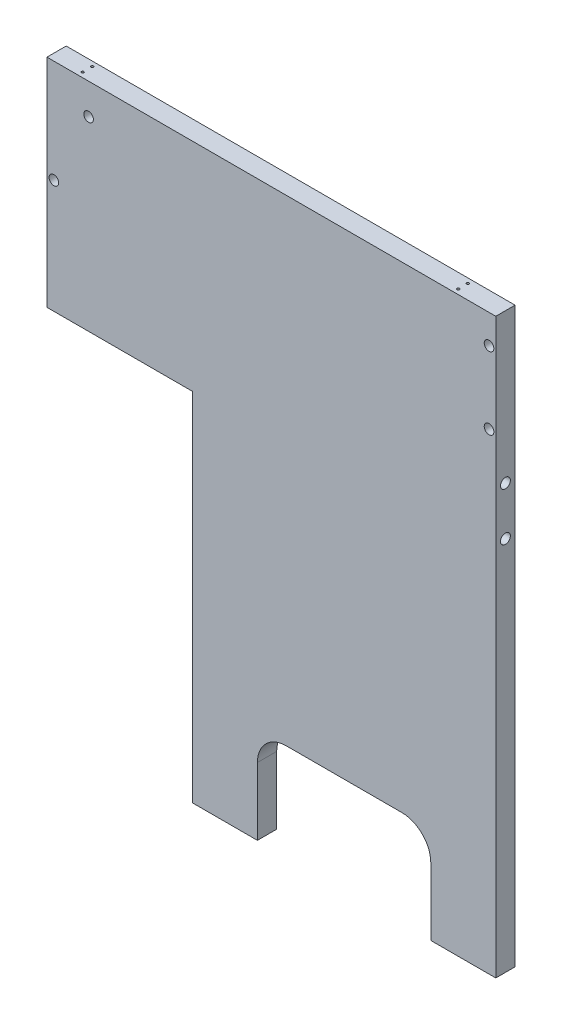
ISO-10303-21;
HEADER;
FILE_DESCRIPTION(('STEP AP214'),'2;1');
FILE_NAME('part.step','',(''),(''),'','','');
FILE_SCHEMA(('AUTOMOTIVE_DESIGN { 1 0 10303 214 1 1 1 1 }'));
ENDSEC;
DATA;
#1=APPLICATION_CONTEXT('core data for automotive mechanical design processes');
#2=APPLICATION_PROTOCOL_DEFINITION('international standard','automotive_design',2000,#1);
#3=PRODUCT_CONTEXT('',#1,'mechanical');
#4=PRODUCT('Part','Part','',(#3));
#5=PRODUCT_RELATED_PRODUCT_CATEGORY('part','',(#4));
#6=PRODUCT_DEFINITION_FORMATION('','',#4);
#7=PRODUCT_DEFINITION_CONTEXT('part definition',#1,'design');
#8=PRODUCT_DEFINITION('design','',#6,#7);
#9=PRODUCT_DEFINITION_SHAPE('','',#8);
#10=(LENGTH_UNIT() NAMED_UNIT(*) SI_UNIT(.MILLI.,.METRE.));
#11=(NAMED_UNIT(*) PLANE_ANGLE_UNIT() SI_UNIT($,.RADIAN.));
#12=(NAMED_UNIT(*) SI_UNIT($,.STERADIAN.) SOLID_ANGLE_UNIT());
#13=UNCERTAINTY_MEASURE_WITH_UNIT(LENGTH_MEASURE(1.E-05),#10,'distance_accuracy_value','');
#14=(GEOMETRIC_REPRESENTATION_CONTEXT(3) GLOBAL_UNCERTAINTY_ASSIGNED_CONTEXT((#13)) GLOBAL_UNIT_ASSIGNED_CONTEXT((#10,
#11,#12)) REPRESENTATION_CONTEXT('',''));
#15=CARTESIAN_POINT('',(0.,0.,0.));
#16=DIRECTION('',(0.,0.,1.));
#17=DIRECTION('',(1.,0.,0.));
#18=AXIS2_PLACEMENT_3D('',#15,#16,#17);
#19=CARTESIAN_POINT('',(466.,-595.,-20.));
#20=DIRECTION('',(0.,-1.,0.));
#21=DIRECTION('',(0.,0.,-1.));
#22=AXIS2_PLACEMENT_3D('',#19,#20,#21);
#23=PLANE('',#22);
#24=DIRECTION('',(0.,0.,1.));
#25=VECTOR('',#24,1.);
#26=CARTESIAN_POINT('',(218.5,-595.,-20.));
#27=LINE('',#26,#25);
#28=CARTESIAN_POINT('',(218.5,-595.,-20.));
#29=VERTEX_POINT('',#28);
#30=CARTESIAN_POINT('',(218.5,-595.,0.));
#31=VERTEX_POINT('',#30);
#32=EDGE_CURVE('E138',#29,#31,#27,.T.);
#33=ORIENTED_EDGE('',*,*,#32,.T.);
#34=DIRECTION('',(1.,0.,0.));
#35=VECTOR('',#34,1.);
#36=CARTESIAN_POINT('',(466.,-595.,0.));
#37=LINE('',#36,#35);
#38=CARTESIAN_POINT('',(151.,-595.,0.));
#39=VERTEX_POINT('',#38);
#40=EDGE_CURVE('E145',#39,#31,#37,.T.);
#41=ORIENTED_EDGE('',*,*,#40,.F.);
#42=DIRECTION('',(0.,0.,1.));
#43=VECTOR('',#42,1.);
#44=CARTESIAN_POINT('',(151.,-595.,-20.));
#45=LINE('',#44,#43);
#46=CARTESIAN_POINT('',(151.,-595.,-20.));
#47=VERTEX_POINT('',#46);
#48=EDGE_CURVE('E124',#47,#39,#45,.T.);
#49=ORIENTED_EDGE('',*,*,#48,.F.);
#50=DIRECTION('',(1.,0.,0.));
#51=VECTOR('',#50,1.);
#52=CARTESIAN_POINT('',(466.,-595.,-20.));
#53=LINE('',#52,#51);
#54=EDGE_CURVE('E114',#47,#29,#53,.T.);
#55=ORIENTED_EDGE('',*,*,#54,.T.);
#56=EDGE_LOOP('',(#33,#41,#49,#55));
#57=FACE_BOUND('',#56,.T.);
#58=ADVANCED_FACE('F34',(#57),#23,.T.);
#59=CARTESIAN_POINT('',(0.,-225.,-20.));
#60=DIRECTION('',(-1.,0.,0.));
#61=DIRECTION('',(0.,0.,1.));
#62=AXIS2_PLACEMENT_3D('',#59,#60,#61);
#63=PLANE('',#62);
#64=CARTESIAN_POINT('',(0.,-205.,-10.));
#65=DIRECTION('',(-1.,0.,0.));
#66=DIRECTION('',(0.,0.,1.));
#67=AXIS2_PLACEMENT_3D('',#64,#65,#66);
#68=CIRCLE('',#67,5.14999999999999);
#69=CARTESIAN_POINT('',(0.,-205.,-4.85000000000001));
#70=VERTEX_POINT('',#69);
#71=EDGE_CURVE('E330',#70,#70,#68,.T.);
#72=ORIENTED_EDGE('',*,*,#71,.F.);
#73=EDGE_LOOP('',(#72));
#74=FACE_BOUND('',#73,.T.);
#75=CARTESIAN_POINT('',(0.,-155.,-10.));
#76=DIRECTION('',(-1.,0.,0.));
#77=DIRECTION('',(0.,0.,1.));
#78=AXIS2_PLACEMENT_3D('',#75,#76,#77);
#79=CIRCLE('',#78,5.14999999999999);
#80=CARTESIAN_POINT('',(0.,-155.,-4.85000000000001));
#81=VERTEX_POINT('',#80);
#82=EDGE_CURVE('E322',#81,#81,#79,.T.);
#83=ORIENTED_EDGE('',*,*,#82,.F.);
#84=EDGE_LOOP('',(#83));
#85=FACE_BOUND('',#84,.T.);
#86=DIRECTION('',(0.,-1.,0.));
#87=VECTOR('',#86,1.);
#88=CARTESIAN_POINT('',(0.,-225.,0.));
#89=LINE('',#88,#87);
#90=CARTESIAN_POINT('',(0.,0.,0.));
#91=VERTEX_POINT('',#90);
#92=CARTESIAN_POINT('',(0.,-225.,0.));
#93=VERTEX_POINT('',#92);
#94=EDGE_CURVE('E134',#91,#93,#89,.T.);
#95=ORIENTED_EDGE('',*,*,#94,.F.);
#96=DIRECTION('',(0.,0.,1.));
#97=VECTOR('',#96,1.);
#98=CARTESIAN_POINT('',(0.,0.,-20.));
#99=LINE('',#98,#97);
#100=CARTESIAN_POINT('',(0.,0.,-20.));
#101=VERTEX_POINT('',#100);
#102=EDGE_CURVE('E11',#101,#91,#99,.T.);
#103=ORIENTED_EDGE('',*,*,#102,.F.);
#104=DIRECTION('',(0.,-1.,0.));
#105=VECTOR('',#104,1.);
#106=CARTESIAN_POINT('',(0.,-225.,-20.));
#107=LINE('',#106,#105);
#108=CARTESIAN_POINT('',(0.,-225.,-20.));
#109=VERTEX_POINT('',#108);
#110=EDGE_CURVE('E151',#101,#109,#107,.T.);
#111=ORIENTED_EDGE('',*,*,#110,.T.);
#112=DIRECTION('',(0.,0.,1.));
#113=VECTOR('',#112,1.);
#114=CARTESIAN_POINT('',(0.,-225.,-20.));
#115=LINE('',#114,#113);
#116=EDGE_CURVE('E38',#109,#93,#115,.T.);
#117=ORIENTED_EDGE('',*,*,#116,.T.);
#118=EDGE_LOOP('',(#95,#103,#111,#117));
#119=FACE_BOUND('',#118,.T.);
#120=ADVANCED_FACE('F36',(#74,#85,#119),#63,.T.);
#121=CARTESIAN_POINT('',(0.,0.,-20.));
#122=DIRECTION('',(0.,1.,0.));
#123=DIRECTION('',(0.,0.,1.));
#124=AXIS2_PLACEMENT_3D('',#121,#122,#123);
#125=PLANE('',#124);
#126=CARTESIAN_POINT('',(32.,0.,-5.));
#127=DIRECTION('',(0.,1.,0.));
#128=DIRECTION('',(0.,0.,1.));
#129=AXIS2_PLACEMENT_3D('',#126,#127,#128);
#130=CIRCLE('',#129,1.24999999999995);
#131=CARTESIAN_POINT('',(32.,0.,-3.75000000000005));
#132=VERTEX_POINT('',#131);
#133=EDGE_CURVE('E574',#132,#132,#130,.T.);
#134=ORIENTED_EDGE('',*,*,#133,.F.);
#135=EDGE_LOOP('',(#134));
#136=FACE_BOUND('',#135,.T.);
#137=CARTESIAN_POINT('',(422.,0.,-15.));
#138=DIRECTION('',(0.,1.,0.));
#139=DIRECTION('',(0.,0.,1.));
#140=AXIS2_PLACEMENT_3D('',#137,#138,#139);
#141=CIRCLE('',#140,1.24999999999996);
#142=CARTESIAN_POINT('',(422.,0.,-13.75));
#143=VERTEX_POINT('',#142);
#144=EDGE_CURVE('E585',#143,#143,#141,.T.);
#145=ORIENTED_EDGE('',*,*,#144,.F.);
#146=EDGE_LOOP('',(#145));
#147=FACE_BOUND('',#146,.T.);
#148=CARTESIAN_POINT('',(422.,0.,-5.));
#149=DIRECTION('',(0.,1.,0.));
#150=DIRECTION('',(0.,0.,1.));
#151=AXIS2_PLACEMENT_3D('',#148,#149,#150);
#152=CIRCLE('',#151,1.24999999999996);
#153=CARTESIAN_POINT('',(422.,0.,-3.75000000000004));
#154=VERTEX_POINT('',#153);
#155=EDGE_CURVE('E591',#154,#154,#152,.T.);
#156=ORIENTED_EDGE('',*,*,#155,.F.);
#157=EDGE_LOOP('',(#156));
#158=FACE_BOUND('',#157,.T.);
#159=CARTESIAN_POINT('',(32.,0.,-15.));
#160=DIRECTION('',(0.,1.,0.));
#161=DIRECTION('',(0.,0.,1.));
#162=AXIS2_PLACEMENT_3D('',#159,#160,#161);
#163=CIRCLE('',#162,1.24999999999995);
#164=CARTESIAN_POINT('',(32.,0.,-13.75));
#165=VERTEX_POINT('',#164);
#166=EDGE_CURVE('E573',#165,#165,#163,.T.);
#167=ORIENTED_EDGE('',*,*,#166,.F.);
#168=EDGE_LOOP('',(#167));
#169=FACE_BOUND('',#168,.T.);
#170=DIRECTION('',(-1.,0.,0.));
#171=VECTOR('',#170,1.);
#172=CARTESIAN_POINT('',(0.,0.,0.));
#173=LINE('',#172,#171);
#174=CARTESIAN_POINT('',(466.,0.,0.));
#175=VERTEX_POINT('',#174);
#176=EDGE_CURVE('E149',#175,#91,#173,.T.);
#177=ORIENTED_EDGE('',*,*,#176,.F.);
#178=DIRECTION('',(0.,0.,1.));
#179=VECTOR('',#178,1.);
#180=CARTESIAN_POINT('',(466.,0.,-20.));
#181=LINE('',#180,#179);
#182=CARTESIAN_POINT('',(466.,0.,-20.));
#183=VERTEX_POINT('',#182);
#184=EDGE_CURVE('E43',#183,#175,#181,.T.);
#185=ORIENTED_EDGE('',*,*,#184,.F.);
#186=DIRECTION('',(-1.,0.,0.));
#187=VECTOR('',#186,1.);
#188=CARTESIAN_POINT('',(0.,0.,-20.));
#189=LINE('',#188,#187);
#190=EDGE_CURVE('E128',#183,#101,#189,.T.);
#191=ORIENTED_EDGE('',*,*,#190,.T.);
#192=ORIENTED_EDGE('',*,*,#102,.T.);
#193=EDGE_LOOP('',(#177,#185,#191,#192));
#194=FACE_BOUND('',#193,.T.);
#195=ADVANCED_FACE('F159',(#136,#147,#158,#169,#194),#125,.T.);
#196=CARTESIAN_POINT('',(466.,0.,-20.));
#197=DIRECTION('',(1.,0.,0.));
#198=DIRECTION('',(0.,0.,-1.));
#199=AXIS2_PLACEMENT_3D('',#196,#197,#198);
#200=PLANE('',#199);
#201=CARTESIAN_POINT('',(466.,-205.,-10.));
#202=DIRECTION('',(1.,0.,0.));
#203=DIRECTION('',(0.,0.,-1.));
#204=AXIS2_PLACEMENT_3D('',#201,#202,#203);
#205=CIRCLE('',#204,5.15);
#206=CARTESIAN_POINT('',(466.,-205.,-15.15));
#207=VERTEX_POINT('',#206);
#208=EDGE_CURVE('E595',#207,#207,#205,.T.);
#209=ORIENTED_EDGE('',*,*,#208,.F.);
#210=EDGE_LOOP('',(#209));
#211=FACE_BOUND('',#210,.T.);
#212=CARTESIAN_POINT('',(466.,-155.,-10.));
#213=DIRECTION('',(1.,0.,0.));
#214=DIRECTION('',(0.,0.,-1.));
#215=AXIS2_PLACEMENT_3D('',#212,#213,#214);
#216=CIRCLE('',#215,5.15);
#217=CARTESIAN_POINT('',(466.,-155.,-15.15));
#218=VERTEX_POINT('',#217);
#219=EDGE_CURVE('E600',#218,#218,#216,.T.);
#220=ORIENTED_EDGE('',*,*,#219,.F.);
#221=EDGE_LOOP('',(#220));
#222=FACE_BOUND('',#221,.T.);
#223=DIRECTION('',(0.,1.,0.));
#224=VECTOR('',#223,1.);
#225=CARTESIAN_POINT('',(466.,0.,0.));
#226=LINE('',#225,#224);
#227=CARTESIAN_POINT('',(466.,-595.,0.));
#228=VERTEX_POINT('',#227);
#229=EDGE_CURVE('E123',#228,#175,#226,.T.);
#230=ORIENTED_EDGE('',*,*,#229,.F.);
#231=DIRECTION('',(0.,0.,1.));
#232=VECTOR('',#231,1.);
#233=CARTESIAN_POINT('',(466.,-595.,-20.));
#234=LINE('',#233,#232);
#235=CARTESIAN_POINT('',(466.,-595.,-20.));
#236=VERTEX_POINT('',#235);
#237=EDGE_CURVE('E108',#236,#228,#234,.T.);
#238=ORIENTED_EDGE('',*,*,#237,.F.);
#239=DIRECTION('',(0.,1.,0.));
#240=VECTOR('',#239,1.);
#241=CARTESIAN_POINT('',(466.,0.,-20.));
#242=LINE('',#241,#240);
#243=EDGE_CURVE('E120',#236,#183,#242,.T.);
#244=ORIENTED_EDGE('',*,*,#243,.T.);
#245=ORIENTED_EDGE('',*,*,#184,.T.);
#246=EDGE_LOOP('',(#230,#238,#244,#245));
#247=FACE_BOUND('',#246,.T.);
#248=ADVANCED_FACE('F119',(#211,#222,#247),#200,.T.);
#249=DIRECTION('',(0.,0.,1.));
#250=VECTOR('',#249,1.);
#251=CARTESIAN_POINT('',(398.5,-595.,-20.));
#252=LINE('',#251,#250);
#253=CARTESIAN_POINT('',(398.5,-595.,-20.));
#254=VERTEX_POINT('',#253);
#255=CARTESIAN_POINT('',(398.5,-595.,0.));
#256=VERTEX_POINT('',#255);
#257=EDGE_CURVE('E51',#254,#256,#252,.T.);
#258=ORIENTED_EDGE('',*,*,#257,.F.);
#259=EDGE_CURVE('E104',#254,#236,#53,.T.);
#260=ORIENTED_EDGE('',*,*,#259,.T.);
#261=ORIENTED_EDGE('',*,*,#237,.T.);
#262=EDGE_CURVE('E144',#256,#228,#37,.T.);
#263=ORIENTED_EDGE('',*,*,#262,.F.);
#264=EDGE_LOOP('',(#258,#260,#261,#263));
#265=FACE_BOUND('',#264,.T.);
#266=ADVANCED_FACE('F106',(#265),#23,.T.);
#267=CARTESIAN_POINT('',(151.,-595.,-20.));
#268=DIRECTION('',(-1.,0.,0.));
#269=DIRECTION('',(0.,0.,1.));
#270=AXIS2_PLACEMENT_3D('',#267,#268,#269);
#271=PLANE('',#270);
#272=DIRECTION('',(0.,-1.,0.));
#273=VECTOR('',#272,1.);
#274=CARTESIAN_POINT('',(151.,-595.,0.));
#275=LINE('',#274,#273);
#276=CARTESIAN_POINT('',(151.,-225.,0.));
#277=VERTEX_POINT('',#276);
#278=EDGE_CURVE('E141',#277,#39,#275,.T.);
#279=ORIENTED_EDGE('',*,*,#278,.F.);
#280=DIRECTION('',(0.,0.,1.));
#281=VECTOR('',#280,1.);
#282=CARTESIAN_POINT('',(151.,-225.,-20.));
#283=LINE('',#282,#281);
#284=CARTESIAN_POINT('',(151.,-225.,-20.));
#285=VERTEX_POINT('',#284);
#286=EDGE_CURVE('E154',#285,#277,#283,.T.);
#287=ORIENTED_EDGE('',*,*,#286,.F.);
#288=DIRECTION('',(0.,-1.,0.));
#289=VECTOR('',#288,1.);
#290=CARTESIAN_POINT('',(151.,-595.,-20.));
#291=LINE('',#290,#289);
#292=EDGE_CURVE('E115',#285,#47,#291,.T.);
#293=ORIENTED_EDGE('',*,*,#292,.T.);
#294=ORIENTED_EDGE('',*,*,#48,.T.);
#295=EDGE_LOOP('',(#279,#287,#293,#294));
#296=FACE_BOUND('',#295,.T.);
#297=ADVANCED_FACE('F183',(#296),#271,.T.);
#298=CARTESIAN_POINT('',(151.,-225.,-20.));
#299=DIRECTION('',(0.,-1.,0.));
#300=DIRECTION('',(1.,0.,0.));
#301=AXIS2_PLACEMENT_3D('',#298,#299,#300);
#302=PLANE('',#301);
#303=DIRECTION('',(1.,0.,0.));
#304=VECTOR('',#303,1.);
#305=CARTESIAN_POINT('',(151.,-225.,0.));
#306=LINE('',#305,#304);
#307=EDGE_CURVE('E137',#93,#277,#306,.T.);
#308=ORIENTED_EDGE('',*,*,#307,.F.);
#309=ORIENTED_EDGE('',*,*,#116,.F.);
#310=DIRECTION('',(1.,0.,0.));
#311=VECTOR('',#310,1.);
#312=CARTESIAN_POINT('',(151.,-225.,-20.));
#313=LINE('',#312,#311);
#314=EDGE_CURVE('E222',#109,#285,#313,.T.);
#315=ORIENTED_EDGE('',*,*,#314,.T.);
#316=ORIENTED_EDGE('',*,*,#286,.T.);
#317=EDGE_LOOP('',(#308,#309,#315,#316));
#318=FACE_BOUND('',#317,.T.);
#319=ADVANCED_FACE('F156',(#318),#302,.T.);
#320=CARTESIAN_POINT('',(0.,0.,-20.));
#321=DIRECTION('',(0.,0.,-1.));
#322=DIRECTION('',(-1.,0.,0.));
#323=AXIS2_PLACEMENT_3D('',#320,#321,#322);
#324=PLANE('',#323);
#325=CARTESIAN_POINT('',(43.2,-32.,-20.));
#326=DIRECTION('',(0.,0.,1.));
#327=DIRECTION('',(1.,0.,0.));
#328=AXIS2_PLACEMENT_3D('',#325,#326,#327);
#329=CIRCLE('',#328,5.);
#330=CARTESIAN_POINT('',(48.2,-32.,-20.));
#331=VERTEX_POINT('',#330);
#332=EDGE_CURVE('E237',#331,#331,#329,.T.);
#333=ORIENTED_EDGE('',*,*,#332,.T.);
#334=EDGE_LOOP('',(#333));
#335=FACE_BOUND('',#334,.T.);
#336=CARTESIAN_POINT('',(459.,-30.,-20.));
#337=DIRECTION('',(0.,0.,1.));
#338=DIRECTION('',(1.,0.,0.));
#339=AXIS2_PLACEMENT_3D('',#336,#337,#338);
#340=CIRCLE('',#339,4.99999999999999);
#341=CARTESIAN_POINT('',(464.,-30.,-20.));
#342=VERTEX_POINT('',#341);
#343=EDGE_CURVE('E336',#342,#342,#340,.T.);
#344=ORIENTED_EDGE('',*,*,#343,.T.);
#345=EDGE_LOOP('',(#344));
#346=FACE_BOUND('',#345,.T.);
#347=CARTESIAN_POINT('',(459.,-105.,-20.));
#348=DIRECTION('',(0.,0.,1.));
#349=DIRECTION('',(1.,0.,0.));
#350=AXIS2_PLACEMENT_3D('',#347,#348,#349);
#351=CIRCLE('',#350,4.99999999999999);
#352=CARTESIAN_POINT('',(464.,-105.,-20.));
#353=VERTEX_POINT('',#352);
#354=EDGE_CURVE('E340',#353,#353,#351,.T.);
#355=ORIENTED_EDGE('',*,*,#354,.T.);
#356=EDGE_LOOP('',(#355));
#357=FACE_BOUND('',#356,.T.);
#358=CARTESIAN_POINT('',(7.20000000000002,-107.,-20.));
#359=DIRECTION('',(0.,0.,1.));
#360=DIRECTION('',(1.,0.,0.));
#361=AXIS2_PLACEMENT_3D('',#358,#359,#360);
#362=CIRCLE('',#361,5.00000000000001);
#363=CARTESIAN_POINT('',(12.2,-107.,-20.));
#364=VERTEX_POINT('',#363);
#365=EDGE_CURVE('E318',#364,#364,#362,.T.);
#366=ORIENTED_EDGE('',*,*,#365,.T.);
#367=EDGE_LOOP('',(#366));
#368=FACE_BOUND('',#367,.T.);
#369=DIRECTION('',(0.,-1.,0.));
#370=VECTOR('',#369,1.);
#371=CARTESIAN_POINT('',(218.5,-595.,-20.));
#372=LINE('',#371,#370);
#373=CARTESIAN_POINT('',(218.5,-525.,-20.));
#374=VERTEX_POINT('',#373);
#375=EDGE_CURVE('E220',#374,#29,#372,.T.);
#376=ORIENTED_EDGE('',*,*,#375,.T.);
#377=ORIENTED_EDGE('',*,*,#54,.F.);
#378=ORIENTED_EDGE('',*,*,#292,.F.);
#379=ORIENTED_EDGE('',*,*,#314,.F.);
#380=ORIENTED_EDGE('',*,*,#110,.F.);
#381=ORIENTED_EDGE('',*,*,#190,.F.);
#382=ORIENTED_EDGE('',*,*,#243,.F.);
#383=ORIENTED_EDGE('',*,*,#259,.F.);
#384=DIRECTION('',(0.,1.,0.));
#385=VECTOR('',#384,1.);
#386=CARTESIAN_POINT('',(398.5,-525.,-20.));
#387=LINE('',#386,#385);
#388=CARTESIAN_POINT('',(398.5,-525.,-20.));
#389=VERTEX_POINT('',#388);
#390=EDGE_CURVE('E246',#254,#389,#387,.T.);
#391=ORIENTED_EDGE('',*,*,#390,.T.);
#392=CARTESIAN_POINT('',(368.5,-525.,-20.));
#393=DIRECTION('',(0.,0.,1.));
#394=DIRECTION('',(-1.,0.,0.));
#395=AXIS2_PLACEMENT_3D('',#392,#393,#394);
#396=CIRCLE('',#395,30.);
#397=CARTESIAN_POINT('',(368.5,-495.,-20.));
#398=VERTEX_POINT('',#397);
#399=EDGE_CURVE('E247',#389,#398,#396,.T.);
#400=ORIENTED_EDGE('',*,*,#399,.T.);
#401=DIRECTION('',(-1.,0.,0.));
#402=VECTOR('',#401,1.);
#403=CARTESIAN_POINT('',(248.5,-495.,-20.));
#404=LINE('',#403,#402);
#405=CARTESIAN_POINT('',(248.5,-495.,-20.));
#406=VERTEX_POINT('',#405);
#407=EDGE_CURVE('E230',#398,#406,#404,.T.);
#408=ORIENTED_EDGE('',*,*,#407,.T.);
#409=CARTESIAN_POINT('',(248.5,-525.,-20.));
#410=DIRECTION('',(0.,0.,1.));
#411=DIRECTION('',(-1.,0.,0.));
#412=AXIS2_PLACEMENT_3D('',#409,#410,#411);
#413=CIRCLE('',#412,30.);
#414=EDGE_CURVE('E227',#406,#374,#413,.T.);
#415=ORIENTED_EDGE('',*,*,#414,.T.);
#416=EDGE_LOOP('',(#376,#377,#378,#379,#380,#381,#382,#383,#391,#400,#408,#415));
#417=FACE_BOUND('',#416,.T.);
#418=ADVANCED_FACE('F127',(#335,#346,#357,#368,#417),#324,.T.);
#419=CARTESIAN_POINT('',(0.,0.,0.));
#420=DIRECTION('',(0.,0.,-1.));
#421=DIRECTION('',(-1.,0.,0.));
#422=AXIS2_PLACEMENT_3D('',#419,#420,#421);
#423=PLANE('',#422);
#424=CARTESIAN_POINT('',(43.2,-32.,0.));
#425=DIRECTION('',(0.,0.,1.));
#426=DIRECTION('',(1.,0.,0.));
#427=AXIS2_PLACEMENT_3D('',#424,#425,#426);
#428=CIRCLE('',#427,5.);
#429=CARTESIAN_POINT('',(48.2,-32.,0.));
#430=VERTEX_POINT('',#429);
#431=EDGE_CURVE('E306',#430,#430,#428,.T.);
#432=ORIENTED_EDGE('',*,*,#431,.F.);
#433=EDGE_LOOP('',(#432));
#434=FACE_BOUND('',#433,.T.);
#435=CARTESIAN_POINT('',(459.,-30.,0.));
#436=DIRECTION('',(0.,0.,1.));
#437=DIRECTION('',(1.,0.,0.));
#438=AXIS2_PLACEMENT_3D('',#435,#436,#437);
#439=CIRCLE('',#438,4.99999999999999);
#440=CARTESIAN_POINT('',(464.,-30.,0.));
#441=VERTEX_POINT('',#440);
#442=EDGE_CURVE('E310',#441,#441,#439,.T.);
#443=ORIENTED_EDGE('',*,*,#442,.F.);
#444=EDGE_LOOP('',(#443));
#445=FACE_BOUND('',#444,.T.);
#446=CARTESIAN_POINT('',(459.,-105.,0.));
#447=DIRECTION('',(0.,0.,1.));
#448=DIRECTION('',(1.,0.,0.));
#449=AXIS2_PLACEMENT_3D('',#446,#447,#448);
#450=CIRCLE('',#449,4.99999999999999);
#451=CARTESIAN_POINT('',(464.,-105.,0.));
#452=VERTEX_POINT('',#451);
#453=EDGE_CURVE('E314',#452,#452,#450,.T.);
#454=ORIENTED_EDGE('',*,*,#453,.F.);
#455=EDGE_LOOP('',(#454));
#456=FACE_BOUND('',#455,.T.);
#457=CARTESIAN_POINT('',(7.20000000000002,-107.,0.));
#458=DIRECTION('',(0.,0.,1.));
#459=DIRECTION('',(1.,0.,0.));
#460=AXIS2_PLACEMENT_3D('',#457,#458,#459);
#461=CIRCLE('',#460,5.00000000000001);
#462=CARTESIAN_POINT('',(12.2,-107.,0.));
#463=VERTEX_POINT('',#462);
#464=EDGE_CURVE('E253',#463,#463,#461,.T.);
#465=ORIENTED_EDGE('',*,*,#464,.F.);
#466=EDGE_LOOP('',(#465));
#467=FACE_BOUND('',#466,.T.);
#468=ORIENTED_EDGE('',*,*,#40,.T.);
#469=DIRECTION('',(0.,-1.,0.));
#470=VECTOR('',#469,1.);
#471=CARTESIAN_POINT('',(218.5,-595.,0.));
#472=LINE('',#471,#470);
#473=CARTESIAN_POINT('',(218.5,-525.,0.));
#474=VERTEX_POINT('',#473);
#475=EDGE_CURVE('E198',#474,#31,#472,.T.);
#476=ORIENTED_EDGE('',*,*,#475,.F.);
#477=CARTESIAN_POINT('',(248.5,-525.,0.));
#478=DIRECTION('',(0.,0.,1.));
#479=DIRECTION('',(-1.,0.,0.));
#480=AXIS2_PLACEMENT_3D('',#477,#478,#479);
#481=CIRCLE('',#480,30.);
#482=CARTESIAN_POINT('',(248.5,-495.,0.));
#483=VERTEX_POINT('',#482);
#484=EDGE_CURVE('E242',#483,#474,#481,.T.);
#485=ORIENTED_EDGE('',*,*,#484,.F.);
#486=DIRECTION('',(-1.,0.,0.));
#487=VECTOR('',#486,1.);
#488=CARTESIAN_POINT('',(248.5,-495.,0.));
#489=LINE('',#488,#487);
#490=CARTESIAN_POINT('',(368.5,-495.,0.));
#491=VERTEX_POINT('',#490);
#492=EDGE_CURVE('E240',#491,#483,#489,.T.);
#493=ORIENTED_EDGE('',*,*,#492,.F.);
#494=CARTESIAN_POINT('',(368.5,-525.,0.));
#495=DIRECTION('',(0.,0.,1.));
#496=DIRECTION('',(-1.,0.,0.));
#497=AXIS2_PLACEMENT_3D('',#494,#495,#496);
#498=CIRCLE('',#497,30.);
#499=CARTESIAN_POINT('',(398.5,-525.,0.));
#500=VERTEX_POINT('',#499);
#501=EDGE_CURVE('E236',#500,#491,#498,.T.);
#502=ORIENTED_EDGE('',*,*,#501,.F.);
#503=DIRECTION('',(0.,1.,0.));
#504=VECTOR('',#503,1.);
#505=CARTESIAN_POINT('',(398.5,-525.,0.));
#506=LINE('',#505,#504);
#507=EDGE_CURVE('E234',#256,#500,#506,.T.);
#508=ORIENTED_EDGE('',*,*,#507,.F.);
#509=ORIENTED_EDGE('',*,*,#262,.T.);
#510=ORIENTED_EDGE('',*,*,#229,.T.);
#511=ORIENTED_EDGE('',*,*,#176,.T.);
#512=ORIENTED_EDGE('',*,*,#94,.T.);
#513=ORIENTED_EDGE('',*,*,#307,.T.);
#514=ORIENTED_EDGE('',*,*,#278,.T.);
#515=EDGE_LOOP('',(#468,#476,#485,#493,#502,#508,#509,#510,#511,#512,#513,#514));
#516=FACE_BOUND('',#515,.T.);
#517=ADVANCED_FACE('F158',(#434,#445,#456,#467,#516),#423,.F.);
#518=CARTESIAN_POINT('',(218.5,-595.,-20.));
#519=DIRECTION('',(-1.,0.,0.));
#520=DIRECTION('',(0.,0.,1.));
#521=AXIS2_PLACEMENT_3D('',#518,#519,#520);
#522=PLANE('',#521);
#523=ORIENTED_EDGE('',*,*,#475,.T.);
#524=ORIENTED_EDGE('',*,*,#32,.F.);
#525=ORIENTED_EDGE('',*,*,#375,.F.);
#526=DIRECTION('',(0.,0.,1.));
#527=VECTOR('',#526,1.);
#528=CARTESIAN_POINT('',(218.5,-525.,-20.));
#529=LINE('',#528,#527);
#530=EDGE_CURVE('E203',#374,#474,#529,.T.);
#531=ORIENTED_EDGE('',*,*,#530,.T.);
#532=EDGE_LOOP('',(#523,#524,#525,#531));
#533=FACE_BOUND('',#532,.T.);
#534=ADVANCED_FACE('F276',(#533),#522,.F.);
#535=CARTESIAN_POINT('',(248.5,-525.,-20.));
#536=DIRECTION('',(0.,0.,1.));
#537=DIRECTION('',(1.,0.,0.));
#538=AXIS2_PLACEMENT_3D('',#535,#536,#537);
#539=CYLINDRICAL_SURFACE('',#538,30.);
#540=ORIENTED_EDGE('',*,*,#484,.T.);
#541=ORIENTED_EDGE('',*,*,#530,.F.);
#542=ORIENTED_EDGE('',*,*,#414,.F.);
#543=DIRECTION('',(0.,0.,1.));
#544=VECTOR('',#543,1.);
#545=CARTESIAN_POINT('',(248.5,-495.,-20.));
#546=LINE('',#545,#544);
#547=EDGE_CURVE('E206',#406,#483,#546,.T.);
#548=ORIENTED_EDGE('',*,*,#547,.T.);
#549=EDGE_LOOP('',(#540,#541,#542,#548));
#550=FACE_BOUND('',#549,.T.);
#551=ADVANCED_FACE('F277',(#550),#539,.F.);
#552=CARTESIAN_POINT('',(248.5,-495.,-20.));
#553=DIRECTION('',(0.,1.,0.));
#554=DIRECTION('',(-1.,0.,0.));
#555=AXIS2_PLACEMENT_3D('',#552,#553,#554);
#556=PLANE('',#555);
#557=ORIENTED_EDGE('',*,*,#492,.T.);
#558=ORIENTED_EDGE('',*,*,#547,.F.);
#559=ORIENTED_EDGE('',*,*,#407,.F.);
#560=DIRECTION('',(0.,0.,1.));
#561=VECTOR('',#560,1.);
#562=CARTESIAN_POINT('',(368.5,-495.,-20.));
#563=LINE('',#562,#561);
#564=EDGE_CURVE('E213',#398,#491,#563,.T.);
#565=ORIENTED_EDGE('',*,*,#564,.T.);
#566=EDGE_LOOP('',(#557,#558,#559,#565));
#567=FACE_BOUND('',#566,.T.);
#568=ADVANCED_FACE('F262',(#567),#556,.F.);
#569=CARTESIAN_POINT('',(368.5,-525.,-20.));
#570=DIRECTION('',(0.,0.,1.));
#571=DIRECTION('',(1.,0.,0.));
#572=AXIS2_PLACEMENT_3D('',#569,#570,#571);
#573=CYLINDRICAL_SURFACE('',#572,30.);
#574=ORIENTED_EDGE('',*,*,#501,.T.);
#575=ORIENTED_EDGE('',*,*,#564,.F.);
#576=ORIENTED_EDGE('',*,*,#399,.F.);
#577=DIRECTION('',(0.,0.,1.));
#578=VECTOR('',#577,1.);
#579=CARTESIAN_POINT('',(398.5,-525.,-20.));
#580=LINE('',#579,#578);
#581=EDGE_CURVE('E216',#389,#500,#580,.T.);
#582=ORIENTED_EDGE('',*,*,#581,.T.);
#583=EDGE_LOOP('',(#574,#575,#576,#582));
#584=FACE_BOUND('',#583,.T.);
#585=ADVANCED_FACE('F280',(#584),#573,.F.);
#586=CARTESIAN_POINT('',(398.5,-525.,-20.));
#587=DIRECTION('',(1.,0.,0.));
#588=DIRECTION('',(0.,0.,-1.));
#589=AXIS2_PLACEMENT_3D('',#586,#587,#588);
#590=PLANE('',#589);
#591=ORIENTED_EDGE('',*,*,#507,.T.);
#592=ORIENTED_EDGE('',*,*,#581,.F.);
#593=ORIENTED_EDGE('',*,*,#390,.F.);
#594=ORIENTED_EDGE('',*,*,#257,.T.);
#595=EDGE_LOOP('',(#591,#592,#593,#594));
#596=FACE_BOUND('',#595,.T.);
#597=ADVANCED_FACE('F281',(#596),#590,.F.);
#598=CARTESIAN_POINT('',(7.20000000000002,-107.,-20.));
#599=DIRECTION('',(0.,0.,1.));
#600=DIRECTION('',(1.,0.,0.));
#601=AXIS2_PLACEMENT_3D('',#598,#599,#600);
#602=CYLINDRICAL_SURFACE('',#601,5.00000000000001);
#603=ORIENTED_EDGE('',*,*,#365,.F.);
#604=EDGE_LOOP('',(#603));
#605=FACE_BOUND('',#604,.T.);
#606=ORIENTED_EDGE('',*,*,#464,.T.);
#607=EDGE_LOOP('',(#606));
#608=FACE_BOUND('',#607,.T.);
#609=ADVANCED_FACE('F283',(#605,#608),#602,.F.);
#610=CARTESIAN_POINT('',(459.,-105.,-20.));
#611=DIRECTION('',(0.,0.,1.));
#612=DIRECTION('',(1.,0.,0.));
#613=AXIS2_PLACEMENT_3D('',#610,#611,#612);
#614=CYLINDRICAL_SURFACE('',#613,4.99999999999999);
#615=ORIENTED_EDGE('',*,*,#354,.F.);
#616=EDGE_LOOP('',(#615));
#617=FACE_BOUND('',#616,.T.);
#618=ORIENTED_EDGE('',*,*,#453,.T.);
#619=EDGE_LOOP('',(#618));
#620=FACE_BOUND('',#619,.T.);
#621=ADVANCED_FACE('F289',(#617,#620),#614,.F.);
#622=CARTESIAN_POINT('',(459.,-30.,-20.));
#623=DIRECTION('',(0.,0.,1.));
#624=DIRECTION('',(1.,0.,0.));
#625=AXIS2_PLACEMENT_3D('',#622,#623,#624);
#626=CYLINDRICAL_SURFACE('',#625,4.99999999999999);
#627=ORIENTED_EDGE('',*,*,#343,.F.);
#628=EDGE_LOOP('',(#627));
#629=FACE_BOUND('',#628,.T.);
#630=ORIENTED_EDGE('',*,*,#442,.T.);
#631=EDGE_LOOP('',(#630));
#632=FACE_BOUND('',#631,.T.);
#633=ADVANCED_FACE('F345',(#629,#632),#626,.F.);
#634=CARTESIAN_POINT('',(43.2,-32.,-20.));
#635=DIRECTION('',(0.,0.,1.));
#636=DIRECTION('',(1.,0.,0.));
#637=AXIS2_PLACEMENT_3D('',#634,#635,#636);
#638=CYLINDRICAL_SURFACE('',#637,5.);
#639=ORIENTED_EDGE('',*,*,#332,.F.);
#640=EDGE_LOOP('',(#639));
#641=FACE_BOUND('',#640,.T.);
#642=ORIENTED_EDGE('',*,*,#431,.T.);
#643=EDGE_LOOP('',(#642));
#644=FACE_BOUND('',#643,.T.);
#645=ADVANCED_FACE('F351',(#641,#644),#638,.F.);
#646=CARTESIAN_POINT('',(20.,-155.,-10.));
#647=DIRECTION('',(-1.,0.,0.));
#648=DIRECTION('',(0.,0.,1.));
#649=AXIS2_PLACEMENT_3D('',#646,#647,#648);
#650=CYLINDRICAL_SURFACE('',#649,5.14999999999999);
#651=CARTESIAN_POINT('',(20.,-155.,-10.));
#652=DIRECTION('',(-1.,0.,0.));
#653=DIRECTION('',(0.,0.,1.));
#654=AXIS2_PLACEMENT_3D('',#651,#652,#653);
#655=CIRCLE('',#654,5.14999999999999);
#656=CARTESIAN_POINT('',(20.,-155.,-4.85000000000001));
#657=VERTEX_POINT('',#656);
#658=EDGE_CURVE('E319',#657,#657,#655,.T.);
#659=ORIENTED_EDGE('',*,*,#658,.F.);
#660=EDGE_LOOP('',(#659));
#661=FACE_BOUND('',#660,.T.);
#662=ORIENTED_EDGE('',*,*,#82,.T.);
#663=EDGE_LOOP('',(#662));
#664=FACE_BOUND('',#663,.T.);
#665=ADVANCED_FACE('F396',(#661,#664),#650,.F.);
#666=CARTESIAN_POINT('',(20.,-155.,-10.));
#667=DIRECTION('',(-1.,0.,0.));
#668=DIRECTION('',(0.,0.,1.));
#669=AXIS2_PLACEMENT_3D('',#666,#667,#668);
#670=PLANE('',#669);
#671=ORIENTED_EDGE('',*,*,#658,.T.);
#672=EDGE_LOOP('',(#671));
#673=FACE_BOUND('',#672,.T.);
#674=ADVANCED_FACE('F412',(#673),#670,.T.);
#675=CARTESIAN_POINT('',(20.,-205.,-10.));
#676=DIRECTION('',(-1.,0.,0.));
#677=DIRECTION('',(0.,0.,1.));
#678=AXIS2_PLACEMENT_3D('',#675,#676,#677);
#679=CYLINDRICAL_SURFACE('',#678,5.14999999999999);
#680=CARTESIAN_POINT('',(20.,-205.,-10.));
#681=DIRECTION('',(-1.,0.,0.));
#682=DIRECTION('',(0.,0.,1.));
#683=AXIS2_PLACEMENT_3D('',#680,#681,#682);
#684=CIRCLE('',#683,5.14999999999999);
#685=CARTESIAN_POINT('',(20.,-205.,-4.85000000000001));
#686=VERTEX_POINT('',#685);
#687=EDGE_CURVE('E327',#686,#686,#684,.T.);
#688=ORIENTED_EDGE('',*,*,#687,.F.);
#689=EDGE_LOOP('',(#688));
#690=FACE_BOUND('',#689,.T.);
#691=ORIENTED_EDGE('',*,*,#71,.T.);
#692=EDGE_LOOP('',(#691));
#693=FACE_BOUND('',#692,.T.);
#694=ADVANCED_FACE('F422',(#690,#693),#679,.F.);
#695=CARTESIAN_POINT('',(20.,-205.,-10.));
#696=DIRECTION('',(-1.,0.,0.));
#697=DIRECTION('',(0.,0.,1.));
#698=AXIS2_PLACEMENT_3D('',#695,#696,#697);
#699=PLANE('',#698);
#700=ORIENTED_EDGE('',*,*,#687,.T.);
#701=EDGE_LOOP('',(#700));
#702=FACE_BOUND('',#701,.T.);
#703=ADVANCED_FACE('F431',(#702),#699,.T.);
#704=CARTESIAN_POINT('',(446.,-155.,-10.));
#705=DIRECTION('',(1.,0.,0.));
#706=DIRECTION('',(0.,0.,-1.));
#707=AXIS2_PLACEMENT_3D('',#704,#705,#706);
#708=CYLINDRICAL_SURFACE('',#707,5.15);
#709=CARTESIAN_POINT('',(446.,-155.,-10.));
#710=DIRECTION('',(1.,0.,0.));
#711=DIRECTION('',(0.,0.,-1.));
#712=AXIS2_PLACEMENT_3D('',#709,#710,#711);
#713=CIRCLE('',#712,5.15);
#714=CARTESIAN_POINT('',(446.,-155.,-15.15));
#715=VERTEX_POINT('',#714);
#716=EDGE_CURVE('E603',#715,#715,#713,.T.);
#717=ORIENTED_EDGE('',*,*,#716,.F.);
#718=EDGE_LOOP('',(#717));
#719=FACE_BOUND('',#718,.T.);
#720=ORIENTED_EDGE('',*,*,#219,.T.);
#721=EDGE_LOOP('',(#720));
#722=FACE_BOUND('',#721,.T.);
#723=ADVANCED_FACE('F441',(#719,#722),#708,.F.);
#724=CARTESIAN_POINT('',(446.,-155.,-10.));
#725=DIRECTION('',(1.,0.,0.));
#726=DIRECTION('',(0.,0.,-1.));
#727=AXIS2_PLACEMENT_3D('',#724,#725,#726);
#728=PLANE('',#727);
#729=ORIENTED_EDGE('',*,*,#716,.T.);
#730=EDGE_LOOP('',(#729));
#731=FACE_BOUND('',#730,.T.);
#732=ADVANCED_FACE('F458',(#731),#728,.T.);
#733=CARTESIAN_POINT('',(446.,-205.,-10.));
#734=DIRECTION('',(1.,0.,0.));
#735=DIRECTION('',(0.,0.,-1.));
#736=AXIS2_PLACEMENT_3D('',#733,#734,#735);
#737=CYLINDRICAL_SURFACE('',#736,5.15);
#738=CARTESIAN_POINT('',(446.,-205.,-10.));
#739=DIRECTION('',(1.,0.,0.));
#740=DIRECTION('',(0.,0.,-1.));
#741=AXIS2_PLACEMENT_3D('',#738,#739,#740);
#742=CIRCLE('',#741,5.15);
#743=CARTESIAN_POINT('',(446.,-205.,-15.15));
#744=VERTEX_POINT('',#743);
#745=EDGE_CURVE('E597',#744,#744,#742,.T.);
#746=ORIENTED_EDGE('',*,*,#745,.F.);
#747=EDGE_LOOP('',(#746));
#748=FACE_BOUND('',#747,.T.);
#749=ORIENTED_EDGE('',*,*,#208,.T.);
#750=EDGE_LOOP('',(#749));
#751=FACE_BOUND('',#750,.T.);
#752=ADVANCED_FACE('F468',(#748,#751),#737,.F.);
#753=CARTESIAN_POINT('',(446.,-205.,-10.));
#754=DIRECTION('',(1.,0.,0.));
#755=DIRECTION('',(0.,0.,-1.));
#756=AXIS2_PLACEMENT_3D('',#753,#754,#755);
#757=PLANE('',#756);
#758=ORIENTED_EDGE('',*,*,#745,.T.);
#759=EDGE_LOOP('',(#758));
#760=FACE_BOUND('',#759,.T.);
#761=ADVANCED_FACE('F477',(#760),#757,.T.);
#762=CARTESIAN_POINT('',(32.,-10.,-15.));
#763=DIRECTION('',(0.,1.,0.));
#764=DIRECTION('',(0.,0.,1.));
#765=AXIS2_PLACEMENT_3D('',#762,#763,#764);
#766=CYLINDRICAL_SURFACE('',#765,1.24999999999995);
#767=CARTESIAN_POINT('',(32.,-10.,-15.));
#768=DIRECTION('',(0.,1.,0.));
#769=DIRECTION('',(0.,0.,1.));
#770=AXIS2_PLACEMENT_3D('',#767,#768,#769);
#771=CIRCLE('',#770,1.24999999999995);
#772=CARTESIAN_POINT('',(32.,-10.,-13.75));
#773=VERTEX_POINT('',#772);
#774=EDGE_CURVE('E577',#773,#773,#771,.T.);
#775=ORIENTED_EDGE('',*,*,#774,.F.);
#776=EDGE_LOOP('',(#775));
#777=FACE_BOUND('',#776,.T.);
#778=ORIENTED_EDGE('',*,*,#166,.T.);
#779=EDGE_LOOP('',(#778));
#780=FACE_BOUND('',#779,.T.);
#781=ADVANCED_FACE('F486',(#777,#780),#766,.F.);
#782=CARTESIAN_POINT('',(32.,-10.,-15.));
#783=DIRECTION('',(0.,1.,0.));
#784=DIRECTION('',(0.,0.,1.));
#785=AXIS2_PLACEMENT_3D('',#782,#783,#784);
#786=PLANE('',#785);
#787=ORIENTED_EDGE('',*,*,#774,.T.);
#788=EDGE_LOOP('',(#787));
#789=FACE_BOUND('',#788,.T.);
#790=ADVANCED_FACE('F496',(#789),#786,.T.);
#791=CARTESIAN_POINT('',(422.,-10.,-5.));
#792=DIRECTION('',(0.,1.,0.));
#793=DIRECTION('',(0.,0.,1.));
#794=AXIS2_PLACEMENT_3D('',#791,#792,#793);
#795=CYLINDRICAL_SURFACE('',#794,1.24999999999996);
#796=CARTESIAN_POINT('',(422.,-10.,-5.));
#797=DIRECTION('',(0.,1.,0.));
#798=DIRECTION('',(0.,0.,1.));
#799=AXIS2_PLACEMENT_3D('',#796,#797,#798);
#800=CIRCLE('',#799,1.24999999999996);
#801=CARTESIAN_POINT('',(422.,-10.,-3.75000000000004));
#802=VERTEX_POINT('',#801);
#803=EDGE_CURVE('E588',#802,#802,#800,.T.);
#804=ORIENTED_EDGE('',*,*,#803,.F.);
#805=EDGE_LOOP('',(#804));
#806=FACE_BOUND('',#805,.T.);
#807=ORIENTED_EDGE('',*,*,#155,.T.);
#808=EDGE_LOOP('',(#807));
#809=FACE_BOUND('',#808,.T.);
#810=ADVANCED_FACE('F503',(#806,#809),#795,.F.);
#811=CARTESIAN_POINT('',(422.,-10.,-5.));
#812=DIRECTION('',(0.,1.,0.));
#813=DIRECTION('',(0.,0.,1.));
#814=AXIS2_PLACEMENT_3D('',#811,#812,#813);
#815=PLANE('',#814);
#816=ORIENTED_EDGE('',*,*,#803,.T.);
#817=EDGE_LOOP('',(#816));
#818=FACE_BOUND('',#817,.T.);
#819=ADVANCED_FACE('F511',(#818),#815,.T.);
#820=CARTESIAN_POINT('',(422.,-10.,-15.));
#821=DIRECTION('',(0.,1.,0.));
#822=DIRECTION('',(0.,0.,1.));
#823=AXIS2_PLACEMENT_3D('',#820,#821,#822);
#824=CYLINDRICAL_SURFACE('',#823,1.24999999999996);
#825=CARTESIAN_POINT('',(422.,-10.,-15.));
#826=DIRECTION('',(0.,1.,0.));
#827=DIRECTION('',(0.,0.,1.));
#828=AXIS2_PLACEMENT_3D('',#825,#826,#827);
#829=CIRCLE('',#828,1.24999999999996);
#830=CARTESIAN_POINT('',(422.,-10.,-13.75));
#831=VERTEX_POINT('',#830);
#832=EDGE_CURVE('E580',#831,#831,#829,.T.);
#833=ORIENTED_EDGE('',*,*,#832,.F.);
#834=EDGE_LOOP('',(#833));
#835=FACE_BOUND('',#834,.T.);
#836=ORIENTED_EDGE('',*,*,#144,.T.);
#837=EDGE_LOOP('',(#836));
#838=FACE_BOUND('',#837,.T.);
#839=ADVANCED_FACE('F519',(#835,#838),#824,.F.);
#840=CARTESIAN_POINT('',(422.,-10.,-15.));
#841=DIRECTION('',(0.,1.,0.));
#842=DIRECTION('',(0.,0.,1.));
#843=AXIS2_PLACEMENT_3D('',#840,#841,#842);
#844=PLANE('',#843);
#845=ORIENTED_EDGE('',*,*,#832,.T.);
#846=EDGE_LOOP('',(#845));
#847=FACE_BOUND('',#846,.T.);
#848=ADVANCED_FACE('F527',(#847),#844,.T.);
#849=CARTESIAN_POINT('',(32.,-10.,-5.));
#850=DIRECTION('',(0.,1.,0.));
#851=DIRECTION('',(0.,0.,1.));
#852=AXIS2_PLACEMENT_3D('',#849,#850,#851);
#853=CYLINDRICAL_SURFACE('',#852,1.24999999999995);
#854=CARTESIAN_POINT('',(32.,-10.,-5.));
#855=DIRECTION('',(0.,1.,0.));
#856=DIRECTION('',(0.,0.,1.));
#857=AXIS2_PLACEMENT_3D('',#854,#855,#856);
#858=CIRCLE('',#857,1.24999999999995);
#859=CARTESIAN_POINT('',(32.,-10.,-3.75000000000005));
#860=VERTEX_POINT('',#859);
#861=EDGE_CURVE('E572',#860,#860,#858,.T.);
#862=ORIENTED_EDGE('',*,*,#861,.F.);
#863=EDGE_LOOP('',(#862));
#864=FACE_BOUND('',#863,.T.);
#865=ORIENTED_EDGE('',*,*,#133,.T.);
#866=EDGE_LOOP('',(#865));
#867=FACE_BOUND('',#866,.T.);
#868=ADVANCED_FACE('F535',(#864,#867),#853,.F.);
#869=CARTESIAN_POINT('',(32.,-10.,-5.));
#870=DIRECTION('',(0.,1.,0.));
#871=DIRECTION('',(0.,0.,1.));
#872=AXIS2_PLACEMENT_3D('',#869,#870,#871);
#873=PLANE('',#872);
#874=ORIENTED_EDGE('',*,*,#861,.T.);
#875=EDGE_LOOP('',(#874));
#876=FACE_BOUND('',#875,.T.);
#877=ADVANCED_FACE('F543',(#876),#873,.T.);
#878=CLOSED_SHELL('',(#58,#120,#195,#248,#266,#297,#319,#418,#517,#534,#551,#568,#585,#597,#609,
#621,#633,#645,#665,#674,#694,#703,#723,#732,#752,#761,#781,#790,#810,#819,#839,#848,#868,#877));
#879=MANIFOLD_SOLID_BREP('B2',#878);
#880=ADVANCED_BREP_SHAPE_REPRESENTATION('',(#18,#879),#14);
#881=SHAPE_DEFINITION_REPRESENTATION(#9,#880);
ENDSEC;
END-ISO-10303-21;
